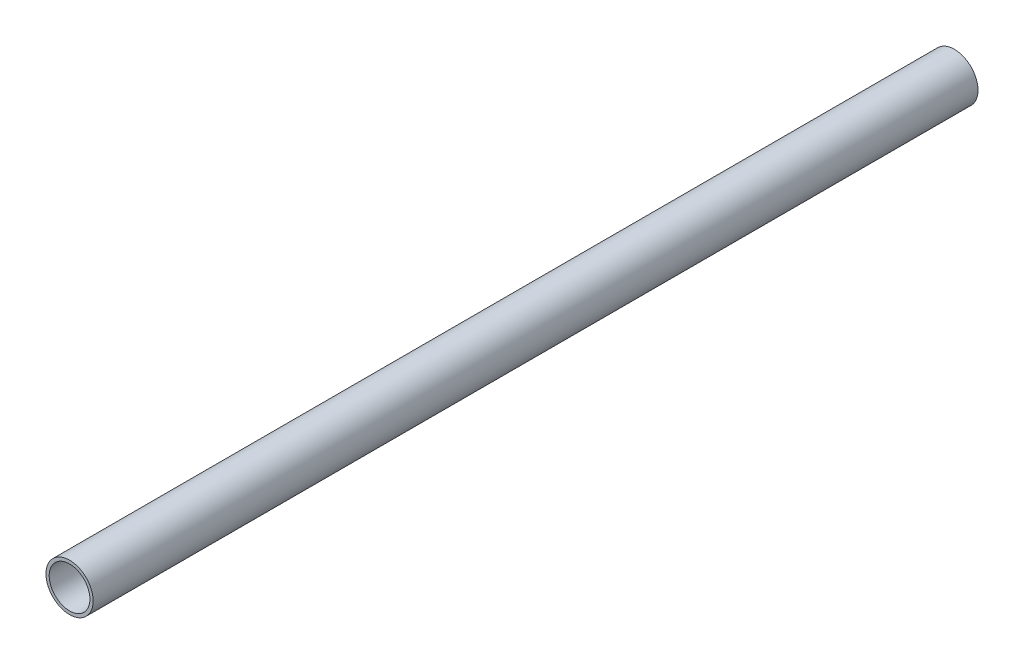
ISO-10303-21;
HEADER;
FILE_DESCRIPTION(('STEP AP214'),'2;1');
FILE_NAME('part.step','',(''),(''),'','','');
FILE_SCHEMA(('AUTOMOTIVE_DESIGN { 1 0 10303 214 1 1 1 1 }'));
ENDSEC;
DATA;
#1=APPLICATION_CONTEXT('core data for automotive mechanical design processes');
#2=APPLICATION_PROTOCOL_DEFINITION('international standard','automotive_design',2000,#1);
#3=PRODUCT_CONTEXT('',#1,'mechanical');
#4=PRODUCT('Part','Part','',(#3));
#5=PRODUCT_RELATED_PRODUCT_CATEGORY('part','',(#4));
#6=PRODUCT_DEFINITION_FORMATION('','',#4);
#7=PRODUCT_DEFINITION_CONTEXT('part definition',#1,'design');
#8=PRODUCT_DEFINITION('design','',#6,#7);
#9=PRODUCT_DEFINITION_SHAPE('','',#8);
#10=(LENGTH_UNIT() NAMED_UNIT(*) SI_UNIT(.MILLI.,.METRE.));
#11=(NAMED_UNIT(*) PLANE_ANGLE_UNIT() SI_UNIT($,.RADIAN.));
#12=(NAMED_UNIT(*) SI_UNIT($,.STERADIAN.) SOLID_ANGLE_UNIT());
#13=UNCERTAINTY_MEASURE_WITH_UNIT(LENGTH_MEASURE(1.E-05),#10,'distance_accuracy_value','');
#14=(GEOMETRIC_REPRESENTATION_CONTEXT(3) GLOBAL_UNCERTAINTY_ASSIGNED_CONTEXT((#13)) GLOBAL_UNIT_ASSIGNED_CONTEXT((#10,
#11,#12)) REPRESENTATION_CONTEXT('',''));
#15=CARTESIAN_POINT('',(0.,0.,0.));
#16=DIRECTION('',(0.,0.,1.));
#17=DIRECTION('',(1.,0.,0.));
#18=AXIS2_PLACEMENT_3D('',#15,#16,#17);
#19=CARTESIAN_POINT('',(0.,0.,300.));
#20=DIRECTION('',(0.,0.,1.));
#21=DIRECTION('',(1.,0.,0.));
#22=AXIS2_PLACEMENT_3D('',#19,#20,#21);
#23=PLANE('',#22);
#24=CARTESIAN_POINT('',(0.,0.,300.));
#25=DIRECTION('',(0.,0.,1.));
#26=DIRECTION('',(1.,0.,0.));
#27=AXIS2_PLACEMENT_3D('',#24,#25,#26);
#28=CIRCLE('',#27,8.);
#29=CARTESIAN_POINT('',(8.,0.,300.));
#30=VERTEX_POINT('',#29);
#31=EDGE_CURVE('E10',#30,#30,#28,.T.);
#32=ORIENTED_EDGE('',*,*,#31,.T.);
#33=EDGE_LOOP('',(#32));
#34=FACE_BOUND('',#33,.T.);
#35=CARTESIAN_POINT('',(0.,0.,300.));
#36=DIRECTION('',(0.,0.,1.));
#37=DIRECTION('',(1.,0.,0.));
#38=AXIS2_PLACEMENT_3D('',#35,#36,#37);
#39=CIRCLE('',#38,6.9);
#40=CARTESIAN_POINT('',(6.9,0.,300.));
#41=VERTEX_POINT('',#40);
#42=EDGE_CURVE('E51',#41,#41,#39,.T.);
#43=ORIENTED_EDGE('',*,*,#42,.F.);
#44=EDGE_LOOP('',(#43));
#45=FACE_BOUND('',#44,.T.);
#46=ADVANCED_FACE('F39',(#34,#45),#23,.T.);
#47=CARTESIAN_POINT('',(0.,0.,0.));
#48=DIRECTION('',(0.,0.,1.));
#49=DIRECTION('',(1.,0.,0.));
#50=AXIS2_PLACEMENT_3D('',#47,#48,#49);
#51=PLANE('',#50);
#52=CARTESIAN_POINT('',(0.,0.,0.));
#53=DIRECTION('',(0.,0.,1.));
#54=DIRECTION('',(1.,0.,0.));
#55=AXIS2_PLACEMENT_3D('',#52,#53,#54);
#56=CIRCLE('',#55,8.);
#57=CARTESIAN_POINT('',(8.,0.,0.));
#58=VERTEX_POINT('',#57);
#59=EDGE_CURVE('E43',#58,#58,#56,.T.);
#60=ORIENTED_EDGE('',*,*,#59,.F.);
#61=EDGE_LOOP('',(#60));
#62=FACE_BOUND('',#61,.T.);
#63=CARTESIAN_POINT('',(0.,0.,0.));
#64=DIRECTION('',(0.,0.,1.));
#65=DIRECTION('',(1.,0.,0.));
#66=AXIS2_PLACEMENT_3D('',#63,#64,#65);
#67=CIRCLE('',#66,6.9);
#68=CARTESIAN_POINT('',(6.9,0.,0.));
#69=VERTEX_POINT('',#68);
#70=EDGE_CURVE('E53',#69,#69,#67,.T.);
#71=ORIENTED_EDGE('',*,*,#70,.T.);
#72=EDGE_LOOP('',(#71));
#73=FACE_BOUND('',#72,.T.);
#74=ADVANCED_FACE('F64',(#62,#73),#51,.F.);
#75=CARTESIAN_POINT('',(0.,0.,300.));
#76=DIRECTION('',(0.,0.,-1.));
#77=DIRECTION('',(-1.,0.,0.));
#78=AXIS2_PLACEMENT_3D('',#75,#76,#77);
#79=CYLINDRICAL_SURFACE('',#78,8.);
#80=ORIENTED_EDGE('',*,*,#31,.F.);
#81=EDGE_LOOP('',(#80));
#82=FACE_BOUND('',#81,.T.);
#83=ORIENTED_EDGE('',*,*,#59,.T.);
#84=EDGE_LOOP('',(#83));
#85=FACE_BOUND('',#84,.T.);
#86=ADVANCED_FACE('F41',(#82,#85),#79,.T.);
#87=CARTESIAN_POINT('',(0.,0.,300.));
#88=DIRECTION('',(0.,0.,-1.));
#89=DIRECTION('',(-1.,0.,0.));
#90=AXIS2_PLACEMENT_3D('',#87,#88,#89);
#91=CYLINDRICAL_SURFACE('',#90,6.9);
#92=ORIENTED_EDGE('',*,*,#42,.T.);
#93=EDGE_LOOP('',(#92));
#94=FACE_BOUND('',#93,.T.);
#95=ORIENTED_EDGE('',*,*,#70,.F.);
#96=EDGE_LOOP('',(#95));
#97=FACE_BOUND('',#96,.T.);
#98=ADVANCED_FACE('F60',(#94,#97),#91,.F.);
#99=CLOSED_SHELL('',(#46,#74,#86,#98));
#100=MANIFOLD_SOLID_BREP('B2',#99);
#101=ADVANCED_BREP_SHAPE_REPRESENTATION('',(#18,#100),#14);
#102=SHAPE_DEFINITION_REPRESENTATION(#9,#101);
ENDSEC;
END-ISO-10303-21;
